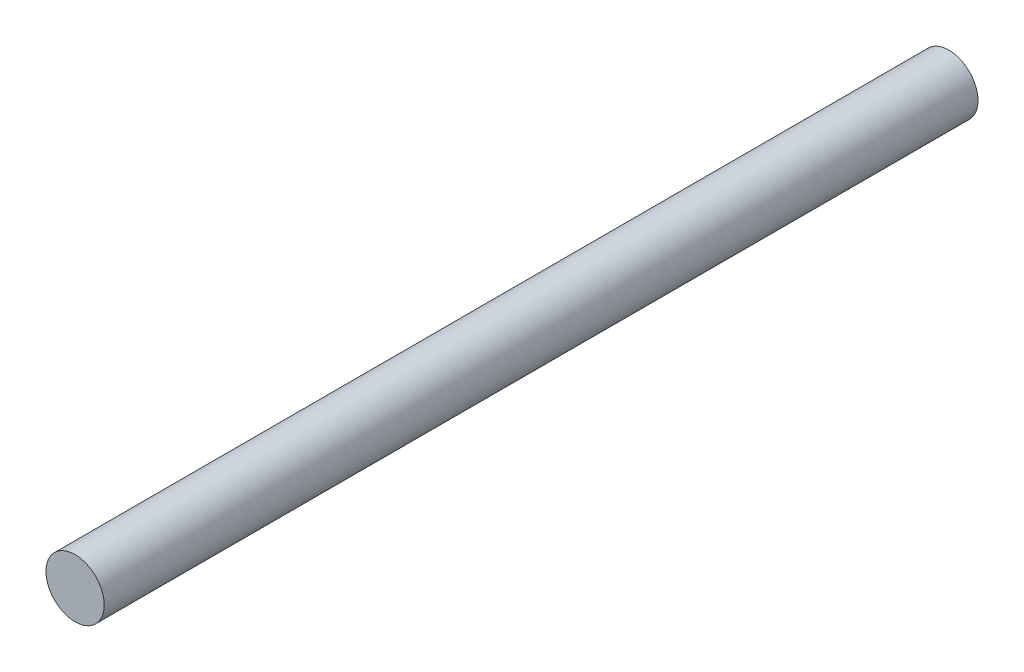
ISO-10303-21;
HEADER;
FILE_DESCRIPTION(('STEP AP214'),'2;1');
FILE_NAME('part.step','',(''),(''),'','','');
FILE_SCHEMA(('AUTOMOTIVE_DESIGN { 1 0 10303 214 1 1 1 1 }'));
ENDSEC;
DATA;
#1=APPLICATION_CONTEXT('core data for automotive mechanical design processes');
#2=APPLICATION_PROTOCOL_DEFINITION('international standard','automotive_design',2000,#1);
#3=PRODUCT_CONTEXT('',#1,'mechanical');
#4=PRODUCT('Part','Part','',(#3));
#5=PRODUCT_RELATED_PRODUCT_CATEGORY('part','',(#4));
#6=PRODUCT_DEFINITION_FORMATION('','',#4);
#7=PRODUCT_DEFINITION_CONTEXT('part definition',#1,'design');
#8=PRODUCT_DEFINITION('design','',#6,#7);
#9=PRODUCT_DEFINITION_SHAPE('','',#8);
#10=(LENGTH_UNIT() NAMED_UNIT(*) SI_UNIT(.MILLI.,.METRE.));
#11=(NAMED_UNIT(*) PLANE_ANGLE_UNIT() SI_UNIT($,.RADIAN.));
#12=(NAMED_UNIT(*) SI_UNIT($,.STERADIAN.) SOLID_ANGLE_UNIT());
#13=UNCERTAINTY_MEASURE_WITH_UNIT(LENGTH_MEASURE(1.E-05),#10,'distance_accuracy_value','');
#14=(GEOMETRIC_REPRESENTATION_CONTEXT(3) GLOBAL_UNCERTAINTY_ASSIGNED_CONTEXT((#13)) GLOBAL_UNIT_ASSIGNED_CONTEXT((#10,
#11,#12)) REPRESENTATION_CONTEXT('',''));
#15=CARTESIAN_POINT('',(0.,0.,0.));
#16=DIRECTION('',(0.,0.,1.));
#17=DIRECTION('',(1.,0.,0.));
#18=AXIS2_PLACEMENT_3D('',#15,#16,#17);
#19=CARTESIAN_POINT('',(0.,0.,75.));
#20=DIRECTION('',(0.,0.,-1.));
#21=DIRECTION('',(-1.,0.,0.));
#22=AXIS2_PLACEMENT_3D('',#19,#20,#21);
#23=CYLINDRICAL_SURFACE('',#22,5.);
#24=CARTESIAN_POINT('',(0.,0.,75.));
#25=DIRECTION('',(0.,0.,1.));
#26=DIRECTION('',(1.,0.,0.));
#27=AXIS2_PLACEMENT_3D('',#24,#25,#26);
#28=CIRCLE('',#27,5.);
#29=CARTESIAN_POINT('',(5.,0.,75.));
#30=VERTEX_POINT('',#29);
#31=EDGE_CURVE('E10',#30,#30,#28,.T.);
#32=ORIENTED_EDGE('',*,*,#31,.F.);
#33=EDGE_LOOP('',(#32));
#34=FACE_BOUND('',#33,.T.);
#35=CARTESIAN_POINT('',(0.,0.,-75.));
#36=DIRECTION('',(0.,0.,1.));
#37=DIRECTION('',(1.,0.,0.));
#38=AXIS2_PLACEMENT_3D('',#35,#36,#37);
#39=CIRCLE('',#38,5.);
#40=CARTESIAN_POINT('',(5.,0.,-75.));
#41=VERTEX_POINT('',#40);
#42=EDGE_CURVE('E34',#41,#41,#39,.T.);
#43=ORIENTED_EDGE('',*,*,#42,.T.);
#44=EDGE_LOOP('',(#43));
#45=FACE_BOUND('',#44,.T.);
#46=ADVANCED_FACE('F31',(#34,#45),#23,.T.);
#47=CARTESIAN_POINT('',(0.,0.,75.));
#48=DIRECTION('',(0.,0.,1.));
#49=DIRECTION('',(1.,0.,0.));
#50=AXIS2_PLACEMENT_3D('',#47,#48,#49);
#51=PLANE('',#50);
#52=ORIENTED_EDGE('',*,*,#31,.T.);
#53=EDGE_LOOP('',(#52));
#54=FACE_BOUND('',#53,.T.);
#55=ADVANCED_FACE('F46',(#54),#51,.T.);
#56=CARTESIAN_POINT('',(0.,0.,-75.));
#57=DIRECTION('',(0.,0.,1.));
#58=DIRECTION('',(1.,0.,0.));
#59=AXIS2_PLACEMENT_3D('',#56,#57,#58);
#60=PLANE('',#59);
#61=ORIENTED_EDGE('',*,*,#42,.F.);
#62=EDGE_LOOP('',(#61));
#63=FACE_BOUND('',#62,.T.);
#64=ADVANCED_FACE('F44',(#63),#60,.F.);
#65=CLOSED_SHELL('',(#46,#55,#64));
#66=MANIFOLD_SOLID_BREP('B2',#65);
#67=ADVANCED_BREP_SHAPE_REPRESENTATION('',(#18,#66),#14);
#68=SHAPE_DEFINITION_REPRESENTATION(#9,#67);
ENDSEC;
END-ISO-10303-21;
